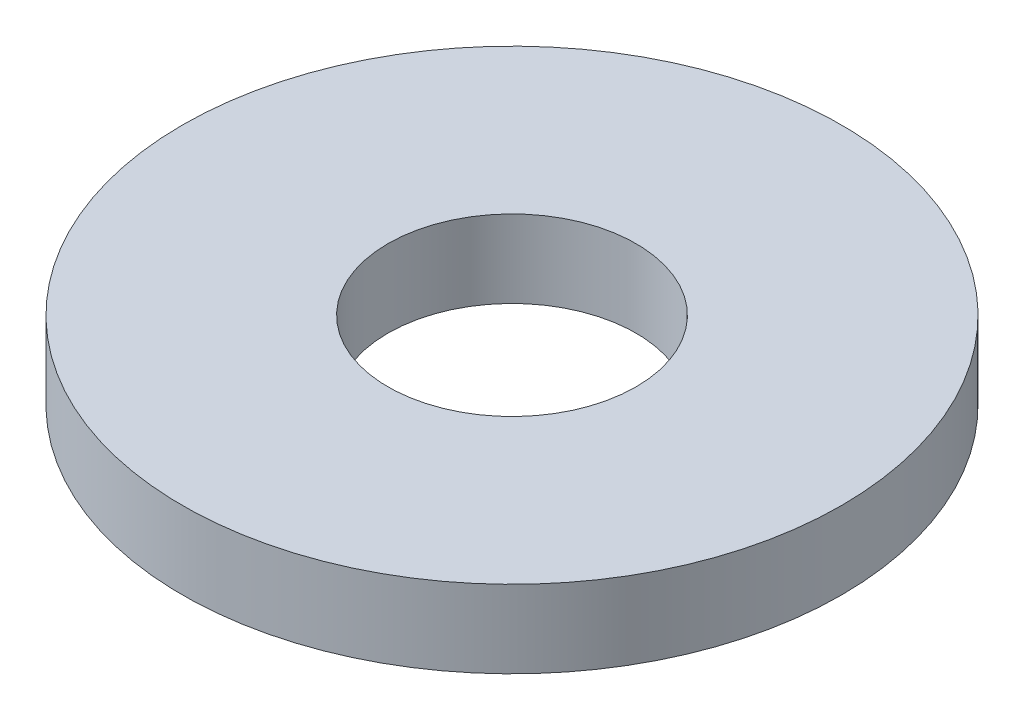
ISO-10303-21;
HEADER;
FILE_DESCRIPTION(('STEP AP214'),'2;1');
FILE_NAME('part.step','',(''),(''),'','','');
FILE_SCHEMA(('AUTOMOTIVE_DESIGN { 1 0 10303 214 1 1 1 1 }'));
ENDSEC;
DATA;
#1=APPLICATION_CONTEXT('core data for automotive mechanical design processes');
#2=APPLICATION_PROTOCOL_DEFINITION('international standard','automotive_design',2000,#1);
#3=PRODUCT_CONTEXT('',#1,'mechanical');
#4=PRODUCT('Part','Part','',(#3));
#5=PRODUCT_RELATED_PRODUCT_CATEGORY('part','',(#4));
#6=PRODUCT_DEFINITION_FORMATION('','',#4);
#7=PRODUCT_DEFINITION_CONTEXT('part definition',#1,'design');
#8=PRODUCT_DEFINITION('design','',#6,#7);
#9=PRODUCT_DEFINITION_SHAPE('','',#8);
#10=(LENGTH_UNIT() NAMED_UNIT(*) SI_UNIT(.MILLI.,.METRE.));
#11=(NAMED_UNIT(*) PLANE_ANGLE_UNIT() SI_UNIT($,.RADIAN.));
#12=(NAMED_UNIT(*) SI_UNIT($,.STERADIAN.) SOLID_ANGLE_UNIT());
#13=UNCERTAINTY_MEASURE_WITH_UNIT(LENGTH_MEASURE(1.E-05),#10,'distance_accuracy_value','');
#14=(GEOMETRIC_REPRESENTATION_CONTEXT(3) GLOBAL_UNCERTAINTY_ASSIGNED_CONTEXT((#13)) GLOBAL_UNIT_ASSIGNED_CONTEXT((#10,
#11,#12)) REPRESENTATION_CONTEXT('',''));
#15=CARTESIAN_POINT('',(0.,0.,0.));
#16=DIRECTION('',(0.,0.,1.));
#17=DIRECTION('',(1.,0.,0.));
#18=AXIS2_PLACEMENT_3D('',#15,#16,#17);
#19=CARTESIAN_POINT('',(0.,0.,0.));
#20=DIRECTION('',(0.,1.,0.));
#21=DIRECTION('',(1.,0.,0.));
#22=AXIS2_PLACEMENT_3D('',#19,#20,#21);
#23=PLANE('',#22);
#24=CARTESIAN_POINT('',(0.,0.,0.));
#25=DIRECTION('',(0.,1.,0.));
#26=DIRECTION('',(-1.,0.,0.));
#27=AXIS2_PLACEMENT_3D('',#24,#25,#26);
#28=CIRCLE('',#27,4.25);
#29=CARTESIAN_POINT('',(-4.25,0.,0.));
#30=VERTEX_POINT('',#29);
#31=EDGE_CURVE('E29',#30,#30,#28,.T.);
#32=ORIENTED_EDGE('',*,*,#31,.F.);
#33=EDGE_LOOP('',(#32));
#34=FACE_BOUND('',#33,.T.);
#35=CARTESIAN_POINT('',(0.,0.,0.));
#36=DIRECTION('',(0.,-1.,0.));
#37=DIRECTION('',(-1.,0.,0.));
#38=AXIS2_PLACEMENT_3D('',#35,#36,#37);
#39=CIRCLE('',#38,1.6);
#40=CARTESIAN_POINT('',(-1.6,0.,0.));
#41=VERTEX_POINT('',#40);
#42=EDGE_CURVE('E10',#41,#41,#39,.T.);
#43=ORIENTED_EDGE('',*,*,#42,.F.);
#44=EDGE_LOOP('',(#43));
#45=FACE_BOUND('',#44,.T.);
#46=ADVANCED_FACE('F15',(#34,#45),#23,.F.);
#47=CARTESIAN_POINT('',(0.,0.,0.));
#48=DIRECTION('',(0.,1.,0.));
#49=DIRECTION('',(1.,0.,0.));
#50=AXIS2_PLACEMENT_3D('',#47,#48,#49);
#51=CYLINDRICAL_SURFACE('',#50,1.6);
#52=CARTESIAN_POINT('',(0.,1.,0.));
#53=DIRECTION('',(0.,-1.,0.));
#54=DIRECTION('',(1.,0.,0.));
#55=AXIS2_PLACEMENT_3D('',#52,#53,#54);
#56=CIRCLE('',#55,1.6);
#57=CARTESIAN_POINT('',(1.6,1.,0.));
#58=VERTEX_POINT('',#57);
#59=EDGE_CURVE('E27',#58,#58,#56,.T.);
#60=ORIENTED_EDGE('',*,*,#59,.F.);
#61=EDGE_LOOP('',(#60));
#62=FACE_BOUND('',#61,.T.);
#63=ORIENTED_EDGE('',*,*,#42,.T.);
#64=EDGE_LOOP('',(#63));
#65=FACE_BOUND('',#64,.T.);
#66=ADVANCED_FACE('F39',(#62,#65),#51,.F.);
#67=CARTESIAN_POINT('',(0.,1.,0.));
#68=DIRECTION('',(0.,1.,0.));
#69=DIRECTION('',(1.,0.,0.));
#70=AXIS2_PLACEMENT_3D('',#67,#68,#69);
#71=PLANE('',#70);
#72=CARTESIAN_POINT('',(0.,1.,0.));
#73=DIRECTION('',(0.,1.,0.));
#74=DIRECTION('',(-1.,0.,0.));
#75=AXIS2_PLACEMENT_3D('',#72,#73,#74);
#76=CIRCLE('',#75,4.25);
#77=CARTESIAN_POINT('',(-4.25,1.,0.));
#78=VERTEX_POINT('',#77);
#79=EDGE_CURVE('E19',#78,#78,#76,.T.);
#80=ORIENTED_EDGE('',*,*,#79,.T.);
#81=EDGE_LOOP('',(#80));
#82=FACE_BOUND('',#81,.T.);
#83=ORIENTED_EDGE('',*,*,#59,.T.);
#84=EDGE_LOOP('',(#83));
#85=FACE_BOUND('',#84,.T.);
#86=ADVANCED_FACE('F45',(#82,#85),#71,.T.);
#87=CARTESIAN_POINT('',(0.,0.,0.));
#88=DIRECTION('',(0.,1.,0.));
#89=DIRECTION('',(1.,0.,0.));
#90=AXIS2_PLACEMENT_3D('',#87,#88,#89);
#91=CYLINDRICAL_SURFACE('',#90,4.25);
#92=ORIENTED_EDGE('',*,*,#79,.F.);
#93=EDGE_LOOP('',(#92));
#94=FACE_BOUND('',#93,.T.);
#95=ORIENTED_EDGE('',*,*,#31,.T.);
#96=EDGE_LOOP('',(#95));
#97=FACE_BOUND('',#96,.T.);
#98=ADVANCED_FACE('F17',(#94,#97),#91,.T.);
#99=CLOSED_SHELL('',(#46,#66,#86,#98));
#100=MANIFOLD_SOLID_BREP('B1',#99);
#101=ADVANCED_BREP_SHAPE_REPRESENTATION('',(#18,#100),#14);
#102=SHAPE_DEFINITION_REPRESENTATION(#9,#101);
ENDSEC;
END-ISO-10303-21;
